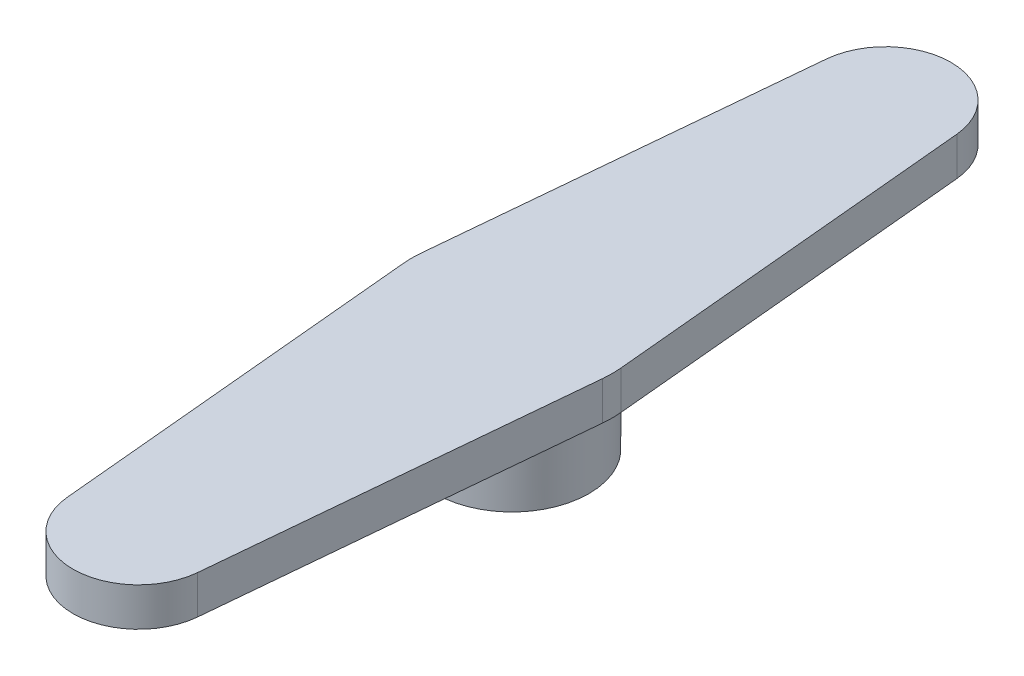
ISO-10303-21;
HEADER;
FILE_DESCRIPTION(('STEP AP214'),'2;1');
FILE_NAME('part.step','',(''),(''),'','','');
FILE_SCHEMA(('AUTOMOTIVE_DESIGN { 1 0 10303 214 1 1 1 1 }'));
ENDSEC;
DATA;
#1=APPLICATION_CONTEXT('core data for automotive mechanical design processes');
#2=APPLICATION_PROTOCOL_DEFINITION('international standard','automotive_design',2000,#1);
#3=PRODUCT_CONTEXT('',#1,'mechanical');
#4=PRODUCT('Part','Part','',(#3));
#5=PRODUCT_RELATED_PRODUCT_CATEGORY('part','',(#4));
#6=PRODUCT_DEFINITION_FORMATION('','',#4);
#7=PRODUCT_DEFINITION_CONTEXT('part definition',#1,'design');
#8=PRODUCT_DEFINITION('design','',#6,#7);
#9=PRODUCT_DEFINITION_SHAPE('','',#8);
#10=(LENGTH_UNIT() NAMED_UNIT(*) SI_UNIT(.MILLI.,.METRE.));
#11=(NAMED_UNIT(*) PLANE_ANGLE_UNIT() SI_UNIT($,.RADIAN.));
#12=(NAMED_UNIT(*) SI_UNIT($,.STERADIAN.) SOLID_ANGLE_UNIT());
#13=UNCERTAINTY_MEASURE_WITH_UNIT(LENGTH_MEASURE(1.E-05),#10,'distance_accuracy_value','');
#14=(GEOMETRIC_REPRESENTATION_CONTEXT(3) GLOBAL_UNCERTAINTY_ASSIGNED_CONTEXT((#13)) GLOBAL_UNIT_ASSIGNED_CONTEXT((#10,
#11,#12)) REPRESENTATION_CONTEXT('',''));
#15=CARTESIAN_POINT('',(0.,0.,0.));
#16=DIRECTION('',(0.,0.,1.));
#17=DIRECTION('',(1.,0.,0.));
#18=AXIS2_PLACEMENT_3D('',#15,#16,#17);
#19=CARTESIAN_POINT('',(6.47196099296681,2.5,-0.603092783505154));
#20=DIRECTION('',(-0.995686306610279,0.,0.0927835051546392));
#21=DIRECTION('',(0.0927835051546392,0.,0.995686306610279));
#22=AXIS2_PLACEMENT_3D('',#19,#20,#21);
#23=PLANE('',#22);
#24=DIRECTION('',(-0.0927835051546392,0.,-0.995686306610279));
#25=VECTOR('',#24,1.);
#26=CARTESIAN_POINT('',(6.47196099296681,0.,-0.603092783505154));
#27=LINE('',#26,#25);
#28=CARTESIAN_POINT('',(6.47196099296681,0.,-0.603092783505155));
#29=VERTEX_POINT('',#28);
#30=CARTESIAN_POINT('',(4.23166680309369,0.,-24.6443298969072));
#31=VERTEX_POINT('',#30);
#32=EDGE_CURVE('E143',#29,#31,#27,.T.);
#33=ORIENTED_EDGE('',*,*,#32,.T.);
#34=DIRECTION('',(0.,-1.,0.));
#35=VECTOR('',#34,1.);
#36=CARTESIAN_POINT('',(4.23166680309369,2.5,-24.6443298969072));
#37=LINE('',#36,#35);
#38=CARTESIAN_POINT('',(4.23166680309369,2.5,-24.6443298969072));
#39=VERTEX_POINT('',#38);
#40=EDGE_CURVE('E50',#39,#31,#37,.T.);
#41=ORIENTED_EDGE('',*,*,#40,.F.);
#42=DIRECTION('',(-0.0927835051546392,0.,-0.995686306610279));
#43=VECTOR('',#42,1.);
#44=CARTESIAN_POINT('',(6.47196099296681,2.5,-0.603092783505154));
#45=LINE('',#44,#43);
#46=CARTESIAN_POINT('',(6.47196099296681,2.5,-0.603092783505155));
#47=VERTEX_POINT('',#46);
#48=EDGE_CURVE('E209',#47,#39,#45,.T.);
#49=ORIENTED_EDGE('',*,*,#48,.F.);
#50=DIRECTION('',(0.,-1.,0.));
#51=VECTOR('',#50,1.);
#52=CARTESIAN_POINT('',(6.47196099296681,2.5,-0.603092783505155));
#53=LINE('',#52,#51);
#54=EDGE_CURVE('E138',#47,#29,#53,.T.);
#55=ORIENTED_EDGE('',*,*,#54,.T.);
#56=EDGE_LOOP('',(#33,#41,#49,#55));
#57=FACE_BOUND('',#56,.T.);
#58=ADVANCED_FACE('F41',(#57),#23,.F.);
#59=CARTESIAN_POINT('',(0.,2.5,-24.25));
#60=DIRECTION('',(0.,-1.,0.));
#61=DIRECTION('',(0.,0.,-1.));
#62=AXIS2_PLACEMENT_3D('',#59,#60,#61);
#63=CYLINDRICAL_SURFACE('',#62,4.25);
#64=CARTESIAN_POINT('',(0.,0.,-24.25));
#65=DIRECTION('',(0.,1.,0.));
#66=DIRECTION('',(0.,0.,1.));
#67=AXIS2_PLACEMENT_3D('',#64,#65,#66);
#68=CIRCLE('',#67,4.25);
#69=CARTESIAN_POINT('',(-4.23166680309369,0.,-24.6443298969072));
#70=VERTEX_POINT('',#69);
#71=EDGE_CURVE('E147',#31,#70,#68,.T.);
#72=ORIENTED_EDGE('',*,*,#71,.T.);
#73=DIRECTION('',(0.,-1.,0.));
#74=VECTOR('',#73,1.);
#75=CARTESIAN_POINT('',(-4.23166680309369,2.5,-24.6443298969072));
#76=LINE('',#75,#74);
#77=CARTESIAN_POINT('',(-4.23166680309369,2.5,-24.6443298969072));
#78=VERTEX_POINT('',#77);
#79=EDGE_CURVE('E179',#78,#70,#76,.T.);
#80=ORIENTED_EDGE('',*,*,#79,.F.);
#81=CARTESIAN_POINT('',(0.,2.5,-24.25));
#82=DIRECTION('',(0.,1.,0.));
#83=DIRECTION('',(0.,0.,1.));
#84=AXIS2_PLACEMENT_3D('',#81,#82,#83);
#85=CIRCLE('',#84,4.25);
#86=EDGE_CURVE('E98',#39,#78,#85,.T.);
#87=ORIENTED_EDGE('',*,*,#86,.F.);
#88=ORIENTED_EDGE('',*,*,#40,.T.);
#89=EDGE_LOOP('',(#72,#80,#87,#88));
#90=FACE_BOUND('',#89,.T.);
#91=ADVANCED_FACE('F184',(#90),#63,.T.);
#92=CARTESIAN_POINT('',(-6.47196099296681,2.5,-0.603092783505155));
#93=DIRECTION('',(0.995686306610279,0.,0.0927835051546392));
#94=DIRECTION('',(0.0927835051546392,0.,-0.995686306610279));
#95=AXIS2_PLACEMENT_3D('',#92,#93,#94);
#96=PLANE('',#95);
#97=DIRECTION('',(-0.0927835051546392,0.,0.995686306610279));
#98=VECTOR('',#97,1.);
#99=CARTESIAN_POINT('',(-6.47196099296681,0.,-0.603092783505155));
#100=LINE('',#99,#98);
#101=CARTESIAN_POINT('',(-6.47196099296681,0.,-0.603092783505154));
#102=VERTEX_POINT('',#101);
#103=EDGE_CURVE('E151',#70,#102,#100,.T.);
#104=ORIENTED_EDGE('',*,*,#103,.T.);
#105=DIRECTION('',(0.,-1.,0.));
#106=VECTOR('',#105,1.);
#107=CARTESIAN_POINT('',(-6.47196099296681,2.5,-0.603092783505154));
#108=LINE('',#107,#106);
#109=CARTESIAN_POINT('',(-6.47196099296681,2.5,-0.603092783505154));
#110=VERTEX_POINT('',#109);
#111=EDGE_CURVE('E175',#110,#102,#108,.T.);
#112=ORIENTED_EDGE('',*,*,#111,.F.);
#113=DIRECTION('',(-0.0927835051546392,0.,0.995686306610279));
#114=VECTOR('',#113,1.);
#115=CARTESIAN_POINT('',(-6.47196099296681,2.5,-0.603092783505155));
#116=LINE('',#115,#114);
#117=EDGE_CURVE('E202',#78,#110,#116,.T.);
#118=ORIENTED_EDGE('',*,*,#117,.F.);
#119=ORIENTED_EDGE('',*,*,#79,.T.);
#120=EDGE_LOOP('',(#104,#112,#118,#119));
#121=FACE_BOUND('',#120,.T.);
#122=ADVANCED_FACE('F195',(#121),#96,.F.);
#123=CARTESIAN_POINT('',(0.,2.5,0.));
#124=DIRECTION('',(0.,-1.,0.));
#125=DIRECTION('',(0.,0.,-1.));
#126=AXIS2_PLACEMENT_3D('',#123,#124,#125);
#127=CYLINDRICAL_SURFACE('',#126,6.5);
#128=CARTESIAN_POINT('',(0.,0.,0.));
#129=DIRECTION('',(0.,1.,0.));
#130=DIRECTION('',(0.,0.,1.));
#131=AXIS2_PLACEMENT_3D('',#128,#129,#130);
#132=CIRCLE('',#131,6.5);
#133=CARTESIAN_POINT('',(-6.47196099296681,0.,0.603092783505154));
#134=VERTEX_POINT('',#133);
#135=EDGE_CURVE('E154',#102,#134,#132,.T.);
#136=ORIENTED_EDGE('',*,*,#135,.T.);
#137=DIRECTION('',(0.,-1.,0.));
#138=VECTOR('',#137,1.);
#139=CARTESIAN_POINT('',(-6.47196099296681,2.5,0.603092783505154));
#140=LINE('',#139,#138);
#141=CARTESIAN_POINT('',(-6.47196099296681,2.5,0.603092783505154));
#142=VERTEX_POINT('',#141);
#143=EDGE_CURVE('E171',#142,#134,#140,.T.);
#144=ORIENTED_EDGE('',*,*,#143,.F.);
#145=CARTESIAN_POINT('',(0.,2.5,0.));
#146=DIRECTION('',(0.,1.,0.));
#147=DIRECTION('',(0.,0.,1.));
#148=AXIS2_PLACEMENT_3D('',#145,#146,#147);
#149=CIRCLE('',#148,6.5);
#150=EDGE_CURVE('E140',#110,#142,#149,.T.);
#151=ORIENTED_EDGE('',*,*,#150,.F.);
#152=ORIENTED_EDGE('',*,*,#111,.T.);
#153=EDGE_LOOP('',(#136,#144,#151,#152));
#154=FACE_BOUND('',#153,.T.);
#155=ADVANCED_FACE('F199',(#154),#127,.T.);
#156=CARTESIAN_POINT('',(-6.47196099296681,2.5,0.603092783505154));
#157=DIRECTION('',(0.995686306610279,0.,-0.0927835051546391));
#158=DIRECTION('',(-0.0927835051546391,0.,-0.995686306610279));
#159=AXIS2_PLACEMENT_3D('',#156,#157,#158);
#160=PLANE('',#159);
#161=DIRECTION('',(0.0927835051546391,0.,0.995686306610279));
#162=VECTOR('',#161,1.);
#163=CARTESIAN_POINT('',(-6.47196099296681,0.,0.603092783505154));
#164=LINE('',#163,#162);
#165=CARTESIAN_POINT('',(-4.23166680309369,0.,24.6443298969072));
#166=VERTEX_POINT('',#165);
#167=EDGE_CURVE('E157',#134,#166,#164,.T.);
#168=ORIENTED_EDGE('',*,*,#167,.T.);
#169=DIRECTION('',(0.,-1.,0.));
#170=VECTOR('',#169,1.);
#171=CARTESIAN_POINT('',(-4.23166680309369,2.5,24.6443298969072));
#172=LINE('',#171,#170);
#173=CARTESIAN_POINT('',(-4.23166680309369,2.5,24.6443298969072));
#174=VERTEX_POINT('',#173);
#175=EDGE_CURVE('E132',#174,#166,#172,.T.);
#176=ORIENTED_EDGE('',*,*,#175,.F.);
#177=DIRECTION('',(0.0927835051546391,0.,0.995686306610279));
#178=VECTOR('',#177,1.);
#179=CARTESIAN_POINT('',(-6.47196099296681,2.5,0.603092783505154));
#180=LINE('',#179,#178);
#181=EDGE_CURVE('E117',#142,#174,#180,.T.);
#182=ORIENTED_EDGE('',*,*,#181,.F.);
#183=ORIENTED_EDGE('',*,*,#143,.T.);
#184=EDGE_LOOP('',(#168,#176,#182,#183));
#185=FACE_BOUND('',#184,.T.);
#186=ADVANCED_FACE('F251',(#185),#160,.F.);
#187=CARTESIAN_POINT('',(0.,2.5,24.25));
#188=DIRECTION('',(0.,-1.,0.));
#189=DIRECTION('',(0.,0.,-1.));
#190=AXIS2_PLACEMENT_3D('',#187,#188,#189);
#191=CYLINDRICAL_SURFACE('',#190,4.25);
#192=CARTESIAN_POINT('',(0.,0.,24.25));
#193=DIRECTION('',(0.,1.,0.));
#194=DIRECTION('',(0.,0.,1.));
#195=AXIS2_PLACEMENT_3D('',#192,#193,#194);
#196=CIRCLE('',#195,4.25);
#197=CARTESIAN_POINT('',(4.23166680309369,0.,24.6443298969072));
#198=VERTEX_POINT('',#197);
#199=EDGE_CURVE('E127',#166,#198,#196,.T.);
#200=ORIENTED_EDGE('',*,*,#199,.T.);
#201=DIRECTION('',(0.,-1.,0.));
#202=VECTOR('',#201,1.);
#203=CARTESIAN_POINT('',(4.23166680309369,2.5,24.6443298969072));
#204=LINE('',#203,#202);
#205=CARTESIAN_POINT('',(4.23166680309369,2.5,24.6443298969072));
#206=VERTEX_POINT('',#205);
#207=EDGE_CURVE('E124',#206,#198,#204,.T.);
#208=ORIENTED_EDGE('',*,*,#207,.F.);
#209=CARTESIAN_POINT('',(0.,2.5,24.25));
#210=DIRECTION('',(0.,1.,0.));
#211=DIRECTION('',(0.,0.,1.));
#212=AXIS2_PLACEMENT_3D('',#209,#210,#211);
#213=CIRCLE('',#212,4.25);
#214=EDGE_CURVE('E111',#174,#206,#213,.T.);
#215=ORIENTED_EDGE('',*,*,#214,.F.);
#216=ORIENTED_EDGE('',*,*,#175,.T.);
#217=EDGE_LOOP('',(#200,#208,#215,#216));
#218=FACE_BOUND('',#217,.T.);
#219=ADVANCED_FACE('F125',(#218),#191,.T.);
#220=CARTESIAN_POINT('',(6.47196099296681,2.5,0.603092783505154));
#221=DIRECTION('',(0.995686306610279,0.,0.0927835051546391));
#222=DIRECTION('',(0.0927835051546391,0.,-0.995686306610279));
#223=AXIS2_PLACEMENT_3D('',#220,#221,#222);
#224=PLANE('',#223);
#225=DIRECTION('',(-0.0927835051546391,0.,0.995686306610279));
#226=VECTOR('',#225,1.);
#227=CARTESIAN_POINT('',(6.47196099296681,0.,0.603092783505154));
#228=LINE('',#227,#226);
#229=CARTESIAN_POINT('',(6.47196099296681,0.,0.603092783505154));
#230=VERTEX_POINT('',#229);
#231=EDGE_CURVE('E162',#230,#198,#228,.T.);
#232=ORIENTED_EDGE('',*,*,#231,.F.);
#233=DIRECTION('',(0.,-1.,0.));
#234=VECTOR('',#233,1.);
#235=CARTESIAN_POINT('',(6.47196099296681,2.5,0.603092783505154));
#236=LINE('',#235,#234);
#237=CARTESIAN_POINT('',(6.47196099296681,2.5,0.603092783505154));
#238=VERTEX_POINT('',#237);
#239=EDGE_CURVE('E86',#238,#230,#236,.T.);
#240=ORIENTED_EDGE('',*,*,#239,.F.);
#241=DIRECTION('',(-0.0927835051546391,0.,0.995686306610279));
#242=VECTOR('',#241,1.);
#243=CARTESIAN_POINT('',(6.47196099296681,2.5,0.603092783505154));
#244=LINE('',#243,#242);
#245=EDGE_CURVE('E115',#238,#206,#244,.T.);
#246=ORIENTED_EDGE('',*,*,#245,.T.);
#247=ORIENTED_EDGE('',*,*,#207,.T.);
#248=EDGE_LOOP('',(#232,#240,#246,#247));
#249=FACE_BOUND('',#248,.T.);
#250=ADVANCED_FACE('F134',(#249),#224,.T.);
#251=EDGE_CURVE('E89',#230,#29,#132,.T.);
#252=ORIENTED_EDGE('',*,*,#251,.T.);
#253=ORIENTED_EDGE('',*,*,#54,.F.);
#254=EDGE_CURVE('E58',#238,#47,#149,.T.);
#255=ORIENTED_EDGE('',*,*,#254,.F.);
#256=ORIENTED_EDGE('',*,*,#239,.T.);
#257=EDGE_LOOP('',(#252,#253,#255,#256));
#258=FACE_BOUND('',#257,.T.);
#259=ADVANCED_FACE('F259',(#258),#127,.T.);
#260=CARTESIAN_POINT('',(0.,2.5,0.));
#261=DIRECTION('',(0.,1.,0.));
#262=DIRECTION('',(0.,0.,1.));
#263=AXIS2_PLACEMENT_3D('',#260,#261,#262);
#264=PLANE('',#263);
#265=ORIENTED_EDGE('',*,*,#48,.T.);
#266=ORIENTED_EDGE('',*,*,#86,.T.);
#267=ORIENTED_EDGE('',*,*,#117,.T.);
#268=ORIENTED_EDGE('',*,*,#150,.T.);
#269=ORIENTED_EDGE('',*,*,#181,.T.);
#270=ORIENTED_EDGE('',*,*,#214,.T.);
#271=ORIENTED_EDGE('',*,*,#245,.F.);
#272=ORIENTED_EDGE('',*,*,#254,.T.);
#273=EDGE_LOOP('',(#265,#266,#267,#268,#269,#270,#271,#272));
#274=FACE_BOUND('',#273,.T.);
#275=ADVANCED_FACE('F113',(#274),#264,.T.);
#276=CARTESIAN_POINT('',(0.,0.,0.));
#277=DIRECTION('',(0.,1.,0.));
#278=DIRECTION('',(0.,0.,1.));
#279=AXIS2_PLACEMENT_3D('',#276,#277,#278);
#280=PLANE('',#279);
#281=CARTESIAN_POINT('',(0.,0.,0.));
#282=DIRECTION('',(0.,1.,0.));
#283=DIRECTION('',(0.,0.,1.));
#284=AXIS2_PLACEMENT_3D('',#281,#282,#283);
#285=CIRCLE('',#284,5.);
#286=CARTESIAN_POINT('',(0.,0.,5.));
#287=VERTEX_POINT('',#286);
#288=EDGE_CURVE('E11',#287,#287,#285,.F.);
#289=ORIENTED_EDGE('',*,*,#288,.F.);
#290=EDGE_LOOP('',(#289));
#291=FACE_BOUND('',#290,.T.);
#292=ORIENTED_EDGE('',*,*,#32,.F.);
#293=ORIENTED_EDGE('',*,*,#251,.F.);
#294=ORIENTED_EDGE('',*,*,#231,.T.);
#295=ORIENTED_EDGE('',*,*,#199,.F.);
#296=ORIENTED_EDGE('',*,*,#167,.F.);
#297=ORIENTED_EDGE('',*,*,#135,.F.);
#298=ORIENTED_EDGE('',*,*,#103,.F.);
#299=ORIENTED_EDGE('',*,*,#71,.F.);
#300=EDGE_LOOP('',(#292,#293,#294,#295,#296,#297,#298,#299));
#301=FACE_BOUND('',#300,.T.);
#302=ADVANCED_FACE('F189',(#291,#301),#280,.F.);
#303=CARTESIAN_POINT('',(0.,-5.,0.));
#304=DIRECTION('',(0.,-1.,0.));
#305=DIRECTION('',(0.,0.,-1.));
#306=AXIS2_PLACEMENT_3D('',#303,#304,#305);
#307=PLANE('',#306);
#308=CARTESIAN_POINT('',(0.,-5.,0.));
#309=DIRECTION('',(0.,-1.,0.));
#310=DIRECTION('',(0.,0.,-1.));
#311=AXIS2_PLACEMENT_3D('',#308,#309,#310);
#312=CIRCLE('',#311,5.);
#313=CARTESIAN_POINT('',(0.,-5.,-5.));
#314=VERTEX_POINT('',#313);
#315=EDGE_CURVE('E148',#314,#314,#312,.T.);
#316=ORIENTED_EDGE('',*,*,#315,.T.);
#317=EDGE_LOOP('',(#316));
#318=FACE_BOUND('',#317,.T.);
#319=CARTESIAN_POINT('',(0.,-5.,0.));
#320=DIRECTION('',(0.,-1.,0.));
#321=DIRECTION('',(0.,0.,-1.));
#322=AXIS2_PLACEMENT_3D('',#319,#320,#321);
#323=CIRCLE('',#322,3.5);
#324=CARTESIAN_POINT('',(0.,-5.,-3.5));
#325=VERTEX_POINT('',#324);
#326=EDGE_CURVE('E215',#325,#325,#323,.T.);
#327=ORIENTED_EDGE('',*,*,#326,.F.);
#328=EDGE_LOOP('',(#327));
#329=FACE_BOUND('',#328,.T.);
#330=ADVANCED_FACE('F227',(#318,#329),#307,.T.);
#331=CARTESIAN_POINT('',(0.,-5.,0.));
#332=DIRECTION('',(0.,1.,0.));
#333=DIRECTION('',(0.,0.,1.));
#334=AXIS2_PLACEMENT_3D('',#331,#332,#333);
#335=CYLINDRICAL_SURFACE('',#334,5.);
#336=ORIENTED_EDGE('',*,*,#315,.F.);
#337=EDGE_LOOP('',(#336));
#338=FACE_BOUND('',#337,.T.);
#339=ORIENTED_EDGE('',*,*,#288,.T.);
#340=EDGE_LOOP('',(#339));
#341=FACE_BOUND('',#340,.T.);
#342=ADVANCED_FACE('F229',(#338,#341),#335,.T.);
#343=CARTESIAN_POINT('',(0.,-5.,0.));
#344=DIRECTION('',(0.,1.,0.));
#345=DIRECTION('',(0.,0.,1.));
#346=AXIS2_PLACEMENT_3D('',#343,#344,#345);
#347=CYLINDRICAL_SURFACE('',#346,3.5);
#348=ORIENTED_EDGE('',*,*,#326,.T.);
#349=EDGE_LOOP('',(#348));
#350=FACE_BOUND('',#349,.T.);
#351=CARTESIAN_POINT('',(0.,0.,0.));
#352=DIRECTION('',(0.,-1.,0.));
#353=DIRECTION('',(0.,0.,-1.));
#354=AXIS2_PLACEMENT_3D('',#351,#352,#353);
#355=CIRCLE('',#354,3.5);
#356=CARTESIAN_POINT('',(0.,0.,-3.5));
#357=VERTEX_POINT('',#356);
#358=EDGE_CURVE('E216',#357,#357,#355,.T.);
#359=ORIENTED_EDGE('',*,*,#358,.F.);
#360=EDGE_LOOP('',(#359));
#361=FACE_BOUND('',#360,.T.);
#362=ADVANCED_FACE('F224',(#350,#361),#347,.F.);
#363=ORIENTED_EDGE('',*,*,#358,.T.);
#364=EDGE_LOOP('',(#363));
#365=FACE_BOUND('',#364,.T.);
#366=ADVANCED_FACE('F240',(#365),#280,.F.);
#367=CLOSED_SHELL('',(#58,#91,#122,#155,#186,#219,#250,#259,#275,#302,#330,#342,#362,#366));
#368=MANIFOLD_SOLID_BREP('B2',#367);
#369=ADVANCED_BREP_SHAPE_REPRESENTATION('',(#18,#368),#14);
#370=SHAPE_DEFINITION_REPRESENTATION(#9,#369);
ENDSEC;
END-ISO-10303-21;
